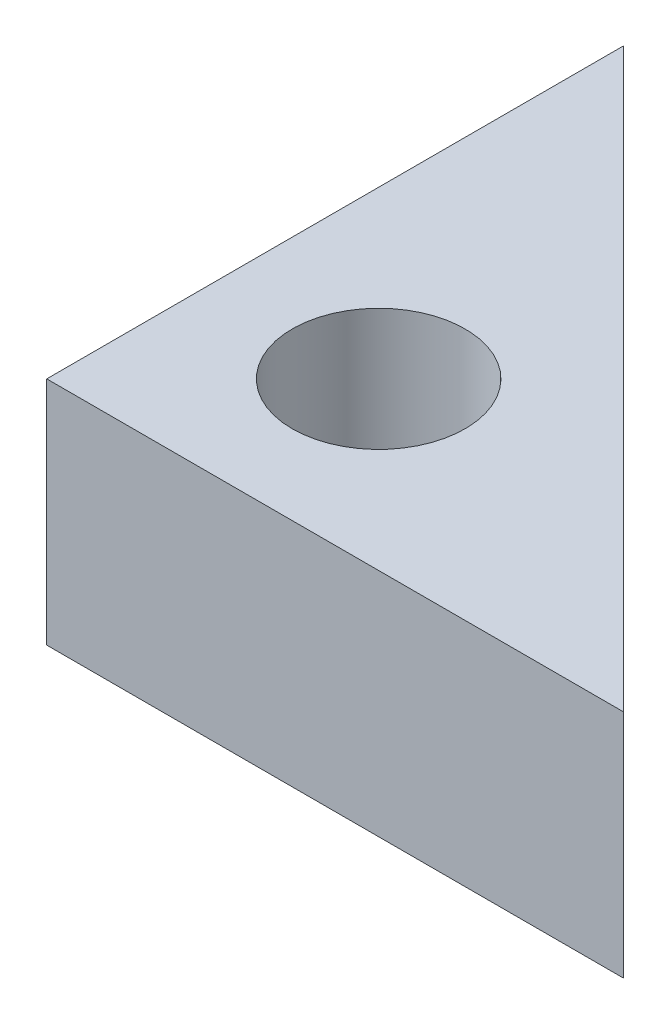
ISO-10303-21;
HEADER;
FILE_DESCRIPTION(('STEP AP214'),'2;1');
FILE_NAME('part.step','',(''),(''),'','','');
FILE_SCHEMA(('AUTOMOTIVE_DESIGN { 1 0 10303 214 1 1 1 1 }'));
ENDSEC;
DATA;
#1=APPLICATION_CONTEXT('core data for automotive mechanical design processes');
#2=APPLICATION_PROTOCOL_DEFINITION('international standard','automotive_design',2000,#1);
#3=PRODUCT_CONTEXT('',#1,'mechanical');
#4=PRODUCT('Part','Part','',(#3));
#5=PRODUCT_RELATED_PRODUCT_CATEGORY('part','',(#4));
#6=PRODUCT_DEFINITION_FORMATION('','',#4);
#7=PRODUCT_DEFINITION_CONTEXT('part definition',#1,'design');
#8=PRODUCT_DEFINITION('design','',#6,#7);
#9=PRODUCT_DEFINITION_SHAPE('','',#8);
#10=(LENGTH_UNIT() NAMED_UNIT(*) SI_UNIT(.MILLI.,.METRE.));
#11=(NAMED_UNIT(*) PLANE_ANGLE_UNIT() SI_UNIT($,.RADIAN.));
#12=(NAMED_UNIT(*) SI_UNIT($,.STERADIAN.) SOLID_ANGLE_UNIT());
#13=UNCERTAINTY_MEASURE_WITH_UNIT(LENGTH_MEASURE(1.E-05),#10,'distance_accuracy_value','');
#14=(GEOMETRIC_REPRESENTATION_CONTEXT(3) GLOBAL_UNCERTAINTY_ASSIGNED_CONTEXT((#13)) GLOBAL_UNIT_ASSIGNED_CONTEXT((#10,
#11,#12)) REPRESENTATION_CONTEXT('',''));
#15=CARTESIAN_POINT('',(0.,0.,0.));
#16=DIRECTION('',(0.,0.,1.));
#17=DIRECTION('',(1.,0.,0.));
#18=AXIS2_PLACEMENT_3D('',#15,#16,#17);
#19=CARTESIAN_POINT('',(0.,4.,0.));
#20=DIRECTION('',(0.,1.,0.));
#21=DIRECTION('',(0.,0.,1.));
#22=AXIS2_PLACEMENT_3D('',#19,#20,#21);
#23=PLANE('',#22);
#24=DIRECTION('',(-0.707106781186548,0.,-0.707106781186548));
#25=VECTOR('',#24,1.);
#26=CARTESIAN_POINT('',(10.,4.,0.));
#27=LINE('',#26,#25);
#28=CARTESIAN_POINT('',(10.,4.,0.));
#29=VERTEX_POINT('',#28);
#30=CARTESIAN_POINT('',(0.,4.,-10.));
#31=VERTEX_POINT('',#30);
#32=EDGE_CURVE('E74',#29,#31,#27,.T.);
#33=ORIENTED_EDGE('',*,*,#32,.T.);
#34=DIRECTION('',(0.,0.,1.));
#35=VECTOR('',#34,1.);
#36=CARTESIAN_POINT('',(0.,4.,-10.));
#37=LINE('',#36,#35);
#38=CARTESIAN_POINT('',(0.,4.,0.));
#39=VERTEX_POINT('',#38);
#40=EDGE_CURVE('E70',#31,#39,#37,.T.);
#41=ORIENTED_EDGE('',*,*,#40,.T.);
#42=DIRECTION('',(1.,0.,0.));
#43=VECTOR('',#42,1.);
#44=CARTESIAN_POINT('',(0.,4.,0.));
#45=LINE('',#44,#43);
#46=EDGE_CURVE('E50',#39,#29,#45,.T.);
#47=ORIENTED_EDGE('',*,*,#46,.T.);
#48=EDGE_LOOP('',(#33,#41,#47));
#49=FACE_BOUND('',#48,.T.);
#50=CARTESIAN_POINT('',(2.87867965644036,4.,-2.87867965644036));
#51=DIRECTION('',(0.,1.,0.));
#52=DIRECTION('',(0.,0.,1.));
#53=AXIS2_PLACEMENT_3D('',#50,#51,#52);
#54=CIRCLE('',#53,1.5);
#55=CARTESIAN_POINT('',(2.87867965644036,4.,-1.37867965644036));
#56=VERTEX_POINT('',#55);
#57=EDGE_CURVE('E84',#56,#56,#54,.T.);
#58=ORIENTED_EDGE('',*,*,#57,.F.);
#59=EDGE_LOOP('',(#58));
#60=FACE_BOUND('',#59,.T.);
#61=ADVANCED_FACE('F33',(#49,#60),#23,.T.);
#62=CARTESIAN_POINT('',(0.,0.,0.));
#63=DIRECTION('',(0.,1.,0.));
#64=DIRECTION('',(0.,0.,1.));
#65=AXIS2_PLACEMENT_3D('',#62,#63,#64);
#66=PLANE('',#65);
#67=DIRECTION('',(-0.707106781186548,0.,-0.707106781186548));
#68=VECTOR('',#67,1.);
#69=CARTESIAN_POINT('',(10.,0.,0.));
#70=LINE('',#69,#68);
#71=CARTESIAN_POINT('',(10.,0.,0.));
#72=VERTEX_POINT('',#71);
#73=CARTESIAN_POINT('',(0.,0.,-10.));
#74=VERTEX_POINT('',#73);
#75=EDGE_CURVE('E81',#72,#74,#70,.T.);
#76=ORIENTED_EDGE('',*,*,#75,.F.);
#77=DIRECTION('',(1.,0.,0.));
#78=VECTOR('',#77,1.);
#79=CARTESIAN_POINT('',(0.,0.,0.));
#80=LINE('',#79,#78);
#81=CARTESIAN_POINT('',(0.,0.,0.));
#82=VERTEX_POINT('',#81);
#83=EDGE_CURVE('E67',#82,#72,#80,.T.);
#84=ORIENTED_EDGE('',*,*,#83,.F.);
#85=DIRECTION('',(0.,0.,1.));
#86=VECTOR('',#85,1.);
#87=CARTESIAN_POINT('',(0.,0.,-10.));
#88=LINE('',#87,#86);
#89=EDGE_CURVE('E62',#74,#82,#88,.T.);
#90=ORIENTED_EDGE('',*,*,#89,.F.);
#91=EDGE_LOOP('',(#76,#84,#90));
#92=FACE_BOUND('',#91,.T.);
#93=CARTESIAN_POINT('',(2.87867965644036,0.,-2.87867965644036));
#94=DIRECTION('',(0.,1.,0.));
#95=DIRECTION('',(0.,0.,1.));
#96=AXIS2_PLACEMENT_3D('',#93,#94,#95);
#97=CIRCLE('',#96,1.5);
#98=CARTESIAN_POINT('',(2.87867965644036,0.,-1.37867965644036));
#99=VERTEX_POINT('',#98);
#100=EDGE_CURVE('E88',#99,#99,#97,.T.);
#101=ORIENTED_EDGE('',*,*,#100,.T.);
#102=EDGE_LOOP('',(#101));
#103=FACE_BOUND('',#102,.T.);
#104=ADVANCED_FACE('F94',(#92,#103),#66,.F.);
#105=CARTESIAN_POINT('',(10.,4.,0.));
#106=DIRECTION('',(-0.707106781186547,0.,0.707106781186547));
#107=DIRECTION('',(0.707106781186548,0.,0.707106781186548));
#108=AXIS2_PLACEMENT_3D('',#105,#106,#107);
#109=PLANE('',#108);
#110=ORIENTED_EDGE('',*,*,#75,.T.);
#111=DIRECTION('',(0.,-1.,0.));
#112=VECTOR('',#111,1.);
#113=CARTESIAN_POINT('',(0.,4.,-10.));
#114=LINE('',#113,#112);
#115=EDGE_CURVE('E11',#31,#74,#114,.T.);
#116=ORIENTED_EDGE('',*,*,#115,.F.);
#117=ORIENTED_EDGE('',*,*,#32,.F.);
#118=DIRECTION('',(0.,-1.,0.));
#119=VECTOR('',#118,1.);
#120=CARTESIAN_POINT('',(10.,4.,0.));
#121=LINE('',#120,#119);
#122=EDGE_CURVE('E82',#29,#72,#121,.T.);
#123=ORIENTED_EDGE('',*,*,#122,.T.);
#124=EDGE_LOOP('',(#110,#116,#117,#123));
#125=FACE_BOUND('',#124,.T.);
#126=ADVANCED_FACE('F35',(#125),#109,.F.);
#127=CARTESIAN_POINT('',(0.,4.,-10.));
#128=DIRECTION('',(1.,0.,0.));
#129=DIRECTION('',(0.,0.,-1.));
#130=AXIS2_PLACEMENT_3D('',#127,#128,#129);
#131=PLANE('',#130);
#132=ORIENTED_EDGE('',*,*,#89,.T.);
#133=DIRECTION('',(0.,-1.,0.));
#134=VECTOR('',#133,1.);
#135=CARTESIAN_POINT('',(0.,4.,0.));
#136=LINE('',#135,#134);
#137=EDGE_CURVE('E42',#39,#82,#136,.T.);
#138=ORIENTED_EDGE('',*,*,#137,.F.);
#139=ORIENTED_EDGE('',*,*,#40,.F.);
#140=ORIENTED_EDGE('',*,*,#115,.T.);
#141=EDGE_LOOP('',(#132,#138,#139,#140));
#142=FACE_BOUND('',#141,.T.);
#143=ADVANCED_FACE('F71',(#142),#131,.F.);
#144=CARTESIAN_POINT('',(0.,4.,0.));
#145=DIRECTION('',(0.,0.,-1.));
#146=DIRECTION('',(-1.,0.,0.));
#147=AXIS2_PLACEMENT_3D('',#144,#145,#146);
#148=PLANE('',#147);
#149=ORIENTED_EDGE('',*,*,#83,.T.);
#150=ORIENTED_EDGE('',*,*,#122,.F.);
#151=ORIENTED_EDGE('',*,*,#46,.F.);
#152=ORIENTED_EDGE('',*,*,#137,.T.);
#153=EDGE_LOOP('',(#149,#150,#151,#152));
#154=FACE_BOUND('',#153,.T.);
#155=ADVANCED_FACE('F93',(#154),#148,.F.);
#156=CARTESIAN_POINT('',(2.87867965644036,4.,-2.87867965644036));
#157=DIRECTION('',(0.,-1.,0.));
#158=DIRECTION('',(0.,0.,-1.));
#159=AXIS2_PLACEMENT_3D('',#156,#157,#158);
#160=CYLINDRICAL_SURFACE('',#159,1.5);
#161=ORIENTED_EDGE('',*,*,#57,.T.);
#162=EDGE_LOOP('',(#161));
#163=FACE_BOUND('',#162,.T.);
#164=ORIENTED_EDGE('',*,*,#100,.F.);
#165=EDGE_LOOP('',(#164));
#166=FACE_BOUND('',#165,.T.);
#167=ADVANCED_FACE('F102',(#163,#166),#160,.F.);
#168=CLOSED_SHELL('',(#61,#104,#126,#143,#155,#167));
#169=MANIFOLD_SOLID_BREP('B2',#168);
#170=ADVANCED_BREP_SHAPE_REPRESENTATION('',(#18,#169),#14);
#171=SHAPE_DEFINITION_REPRESENTATION(#9,#170);
ENDSEC;
END-ISO-10303-21;
